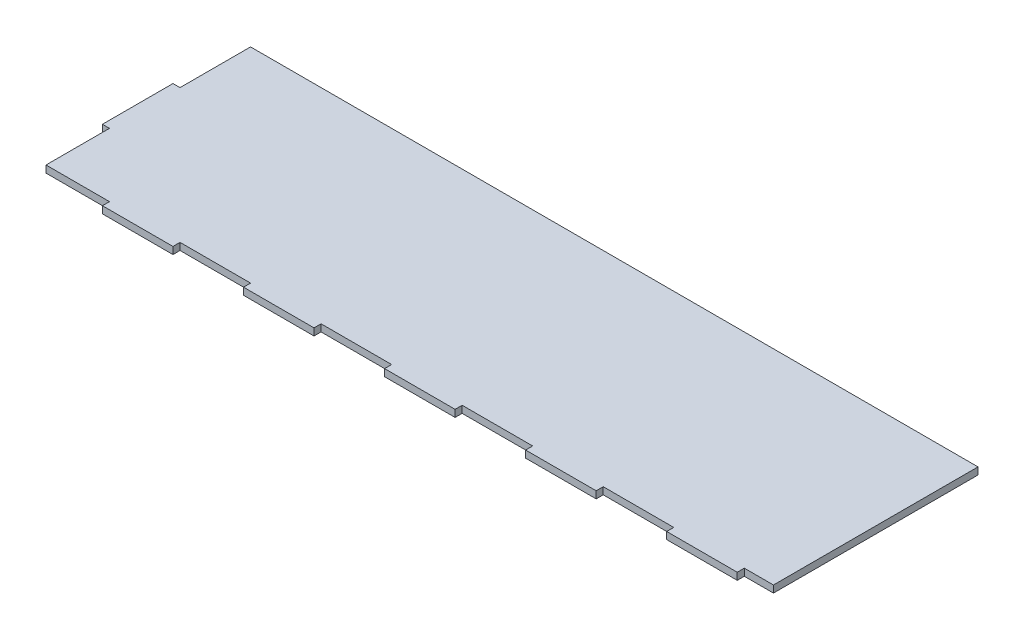
ISO-10303-21;
HEADER;
FILE_DESCRIPTION(('STEP AP214'),'2;1');
FILE_NAME('part.step','',(''),(''),'','','');
FILE_SCHEMA(('AUTOMOTIVE_DESIGN { 1 0 10303 214 1 1 1 1 }'));
ENDSEC;
DATA;
#1=APPLICATION_CONTEXT('core data for automotive mechanical design processes');
#2=APPLICATION_PROTOCOL_DEFINITION('international standard','automotive_design',2000,#1);
#3=PRODUCT_CONTEXT('',#1,'mechanical');
#4=PRODUCT('Part','Part','',(#3));
#5=PRODUCT_RELATED_PRODUCT_CATEGORY('part','',(#4));
#6=PRODUCT_DEFINITION_FORMATION('','',#4);
#7=PRODUCT_DEFINITION_CONTEXT('part definition',#1,'design');
#8=PRODUCT_DEFINITION('design','',#6,#7);
#9=PRODUCT_DEFINITION_SHAPE('','',#8);
#10=(LENGTH_UNIT() NAMED_UNIT(*) SI_UNIT(.MILLI.,.METRE.));
#11=(NAMED_UNIT(*) PLANE_ANGLE_UNIT() SI_UNIT($,.RADIAN.));
#12=(NAMED_UNIT(*) SI_UNIT($,.STERADIAN.) SOLID_ANGLE_UNIT());
#13=UNCERTAINTY_MEASURE_WITH_UNIT(LENGTH_MEASURE(1.E-05),#10,'distance_accuracy_value','');
#14=(GEOMETRIC_REPRESENTATION_CONTEXT(3) GLOBAL_UNCERTAINTY_ASSIGNED_CONTEXT((#13)) GLOBAL_UNIT_ASSIGNED_CONTEXT((#10,
#11,#12)) REPRESENTATION_CONTEXT('',''));
#15=CARTESIAN_POINT('',(0.,0.,0.));
#16=DIRECTION('',(0.,0.,1.));
#17=DIRECTION('',(1.,0.,0.));
#18=AXIS2_PLACEMENT_3D('',#15,#16,#17);
#19=CARTESIAN_POINT('',(-2.60000000000005,0.,0.));
#20=DIRECTION('',(1.,0.,0.));
#21=DIRECTION('',(0.,0.,-1.));
#22=AXIS2_PLACEMENT_3D('',#19,#20,#21);
#23=PLANE('',#22);
#24=DIRECTION('',(0.,0.,1.));
#25=VECTOR('',#24,1.);
#26=CARTESIAN_POINT('',(-2.60000000000005,0.,0.));
#27=LINE('',#26,#25);
#28=CARTESIAN_POINT('',(-2.60000000000005,0.,-45.));
#29=VERTEX_POINT('',#28);
#30=CARTESIAN_POINT('',(-2.60000000000005,0.,42.));
#31=VERTEX_POINT('',#30);
#32=EDGE_CURVE('E241',#29,#31,#27,.T.);
#33=ORIENTED_EDGE('',*,*,#32,.F.);
#34=DIRECTION('',(0.,1.,0.));
#35=VECTOR('',#34,1.);
#36=CARTESIAN_POINT('',(-2.60000000000005,3.,-45.));
#37=LINE('',#36,#35);
#38=CARTESIAN_POINT('',(-2.60000000000005,3.,-45.));
#39=VERTEX_POINT('',#38);
#40=EDGE_CURVE('E65',#29,#39,#37,.T.);
#41=ORIENTED_EDGE('',*,*,#40,.T.);
#42=DIRECTION('',(0.,0.,1.));
#43=VECTOR('',#42,1.);
#44=CARTESIAN_POINT('',(-2.60000000000005,3.,0.));
#45=LINE('',#44,#43);
#46=CARTESIAN_POINT('',(-2.60000000000005,3.,42.));
#47=VERTEX_POINT('',#46);
#48=EDGE_CURVE('E58',#39,#47,#45,.T.);
#49=ORIENTED_EDGE('',*,*,#48,.T.);
#50=DIRECTION('',(0.,-1.,0.));
#51=VECTOR('',#50,1.);
#52=CARTESIAN_POINT('',(-2.60000000000005,0.,42.));
#53=LINE('',#52,#51);
#54=EDGE_CURVE('E12',#47,#31,#53,.T.);
#55=ORIENTED_EDGE('',*,*,#54,.T.);
#56=EDGE_LOOP('',(#33,#41,#49,#55));
#57=FACE_BOUND('',#56,.T.);
#58=ADVANCED_FACE('F42',(#57),#23,.T.);
#59=CARTESIAN_POINT('',(-315.,3.,-45.));
#60=DIRECTION('',(0.,0.,1.));
#61=DIRECTION('',(1.,0.,0.));
#62=AXIS2_PLACEMENT_3D('',#59,#60,#61);
#63=PLANE('',#62);
#64=ORIENTED_EDGE('',*,*,#40,.F.);
#65=DIRECTION('',(-1.,0.,0.));
#66=VECTOR('',#65,1.);
#67=CARTESIAN_POINT('',(-315.,0.,-45.));
#68=LINE('',#67,#66);
#69=CARTESIAN_POINT('',(-312.,0.,-45.));
#70=VERTEX_POINT('',#69);
#71=EDGE_CURVE('E244',#29,#70,#68,.T.);
#72=ORIENTED_EDGE('',*,*,#71,.T.);
#73=DIRECTION('',(0.,1.,0.));
#74=VECTOR('',#73,1.);
#75=CARTESIAN_POINT('',(-312.,0.,-45.));
#76=LINE('',#75,#74);
#77=CARTESIAN_POINT('',(-312.,3.,-45.));
#78=VERTEX_POINT('',#77);
#79=EDGE_CURVE('E286',#70,#78,#76,.T.);
#80=ORIENTED_EDGE('',*,*,#79,.T.);
#81=DIRECTION('',(-1.,0.,0.));
#82=VECTOR('',#81,1.);
#83=CARTESIAN_POINT('',(-315.,3.,-45.));
#84=LINE('',#83,#82);
#85=EDGE_CURVE('E475',#39,#78,#84,.T.);
#86=ORIENTED_EDGE('',*,*,#85,.F.);
#87=EDGE_LOOP('',(#64,#72,#80,#86));
#88=FACE_BOUND('',#87,.T.);
#89=ADVANCED_FACE('F44',(#88),#63,.F.);
#90=CARTESIAN_POINT('',(0.,3.,0.));
#91=DIRECTION('',(0.,-1.,0.));
#92=DIRECTION('',(0.,0.,-1.));
#93=AXIS2_PLACEMENT_3D('',#90,#91,#92);
#94=PLANE('',#93);
#95=ORIENTED_EDGE('',*,*,#48,.F.);
#96=ORIENTED_EDGE('',*,*,#85,.T.);
#97=DIRECTION('',(0.,0.,-1.));
#98=VECTOR('',#97,1.);
#99=CARTESIAN_POINT('',(-312.,3.,-45.));
#100=LINE('',#99,#98);
#101=CARTESIAN_POINT('',(-312.,3.,-15.));
#102=VERTEX_POINT('',#101);
#103=EDGE_CURVE('E276',#102,#78,#100,.T.);
#104=ORIENTED_EDGE('',*,*,#103,.F.);
#105=DIRECTION('',(1.,0.,0.));
#106=VECTOR('',#105,1.);
#107=CARTESIAN_POINT('',(-315.,3.,-15.));
#108=LINE('',#107,#106);
#109=CARTESIAN_POINT('',(-315.,3.,-15.));
#110=VERTEX_POINT('',#109);
#111=EDGE_CURVE('E270',#110,#102,#108,.T.);
#112=ORIENTED_EDGE('',*,*,#111,.F.);
#113=DIRECTION('',(0.,0.,1.));
#114=VECTOR('',#113,1.);
#115=CARTESIAN_POINT('',(-315.,3.,45.));
#116=LINE('',#115,#114);
#117=CARTESIAN_POINT('',(-315.,3.,15.));
#118=VERTEX_POINT('',#117);
#119=EDGE_CURVE('E478',#110,#118,#116,.T.);
#120=ORIENTED_EDGE('',*,*,#119,.T.);
#121=DIRECTION('',(-1.,0.,0.));
#122=VECTOR('',#121,1.);
#123=CARTESIAN_POINT('',(-315.,3.,15.));
#124=LINE('',#123,#122);
#125=CARTESIAN_POINT('',(-312.,3.,15.));
#126=VERTEX_POINT('',#125);
#127=EDGE_CURVE('E257',#126,#118,#124,.T.);
#128=ORIENTED_EDGE('',*,*,#127,.F.);
#129=DIRECTION('',(0.,0.,-1.));
#130=VECTOR('',#129,1.);
#131=CARTESIAN_POINT('',(-312.,3.,42.));
#132=LINE('',#131,#130);
#133=CARTESIAN_POINT('',(-312.,3.,42.));
#134=VERTEX_POINT('',#133);
#135=EDGE_CURVE('E251',#134,#126,#132,.T.);
#136=ORIENTED_EDGE('',*,*,#135,.F.);
#137=DIRECTION('',(-1.,0.,0.));
#138=VECTOR('',#137,1.);
#139=CARTESIAN_POINT('',(-315.,3.,42.));
#140=LINE('',#139,#138);
#141=CARTESIAN_POINT('',(-285.,3.,42.));
#142=VERTEX_POINT('',#141);
#143=EDGE_CURVE('E388',#142,#134,#140,.T.);
#144=ORIENTED_EDGE('',*,*,#143,.F.);
#145=DIRECTION('',(0.,0.,-1.));
#146=VECTOR('',#145,1.);
#147=CARTESIAN_POINT('',(-285.,3.,45.));
#148=LINE('',#147,#146);
#149=CARTESIAN_POINT('',(-285.,3.,45.));
#150=VERTEX_POINT('',#149);
#151=EDGE_CURVE('E290',#150,#142,#148,.T.);
#152=ORIENTED_EDGE('',*,*,#151,.F.);
#153=DIRECTION('',(1.,0.,0.));
#154=VECTOR('',#153,1.);
#155=CARTESIAN_POINT('',(-315.,3.,45.));
#156=LINE('',#155,#154);
#157=CARTESIAN_POINT('',(-255.,3.,45.));
#158=VERTEX_POINT('',#157);
#159=EDGE_CURVE('E504',#150,#158,#156,.T.);
#160=ORIENTED_EDGE('',*,*,#159,.T.);
#161=DIRECTION('',(0.,0.,1.));
#162=VECTOR('',#161,1.);
#163=CARTESIAN_POINT('',(-255.,3.,45.));
#164=LINE('',#163,#162);
#165=CARTESIAN_POINT('',(-255.,3.,42.));
#166=VERTEX_POINT('',#165);
#167=EDGE_CURVE('E429',#166,#158,#164,.T.);
#168=ORIENTED_EDGE('',*,*,#167,.F.);
#169=DIRECTION('',(-1.,0.,0.));
#170=VECTOR('',#169,1.);
#171=CARTESIAN_POINT('',(-255.,3.,42.));
#172=LINE('',#171,#170);
#173=CARTESIAN_POINT('',(-225.,3.,42.));
#174=VERTEX_POINT('',#173);
#175=EDGE_CURVE('E444',#174,#166,#172,.T.);
#176=ORIENTED_EDGE('',*,*,#175,.F.);
#177=DIRECTION('',(0.,0.,-1.));
#178=VECTOR('',#177,1.);
#179=CARTESIAN_POINT('',(-225.,3.,45.));
#180=LINE('',#179,#178);
#181=CARTESIAN_POINT('',(-225.,3.,45.));
#182=VERTEX_POINT('',#181);
#183=EDGE_CURVE('E456',#182,#174,#180,.T.);
#184=ORIENTED_EDGE('',*,*,#183,.F.);
#185=CARTESIAN_POINT('',(-195.,3.,45.));
#186=VERTEX_POINT('',#185);
#187=EDGE_CURVE('E488',#182,#186,#156,.T.);
#188=ORIENTED_EDGE('',*,*,#187,.T.);
#189=DIRECTION('',(0.,0.,1.));
#190=VECTOR('',#189,1.);
#191=CARTESIAN_POINT('',(-195.,3.,45.));
#192=LINE('',#191,#190);
#193=CARTESIAN_POINT('',(-195.,3.,42.));
#194=VERTEX_POINT('',#193);
#195=EDGE_CURVE('E324',#194,#186,#192,.T.);
#196=ORIENTED_EDGE('',*,*,#195,.F.);
#197=DIRECTION('',(-1.,0.,0.));
#198=VECTOR('',#197,1.);
#199=CARTESIAN_POINT('',(-195.,3.,42.));
#200=LINE('',#199,#198);
#201=CARTESIAN_POINT('',(-165.,3.,42.));
#202=VERTEX_POINT('',#201);
#203=EDGE_CURVE('E408',#202,#194,#200,.T.);
#204=ORIENTED_EDGE('',*,*,#203,.F.);
#205=DIRECTION('',(0.,0.,-1.));
#206=VECTOR('',#205,1.);
#207=CARTESIAN_POINT('',(-165.,3.,45.));
#208=LINE('',#207,#206);
#209=CARTESIAN_POINT('',(-165.,3.,45.));
#210=VERTEX_POINT('',#209);
#211=EDGE_CURVE('E419',#210,#202,#208,.T.);
#212=ORIENTED_EDGE('',*,*,#211,.F.);
#213=CARTESIAN_POINT('',(-135.,3.,45.));
#214=VERTEX_POINT('',#213);
#215=EDGE_CURVE('E636',#210,#214,#156,.T.);
#216=ORIENTED_EDGE('',*,*,#215,.T.);
#217=DIRECTION('',(0.,0.,1.));
#218=VECTOR('',#217,1.);
#219=CARTESIAN_POINT('',(-135.,3.,45.));
#220=LINE('',#219,#218);
#221=CARTESIAN_POINT('',(-135.,3.,42.));
#222=VERTEX_POINT('',#221);
#223=EDGE_CURVE('E310',#222,#214,#220,.T.);
#224=ORIENTED_EDGE('',*,*,#223,.F.);
#225=DIRECTION('',(-1.,0.,0.));
#226=VECTOR('',#225,1.);
#227=CARTESIAN_POINT('',(-135.,3.,42.));
#228=LINE('',#227,#226);
#229=CARTESIAN_POINT('',(-105.,3.,42.));
#230=VERTEX_POINT('',#229);
#231=EDGE_CURVE('E301',#230,#222,#228,.T.);
#232=ORIENTED_EDGE('',*,*,#231,.F.);
#233=DIRECTION('',(0.,0.,-1.));
#234=VECTOR('',#233,1.);
#235=CARTESIAN_POINT('',(-105.,3.,45.));
#236=LINE('',#235,#234);
#237=CARTESIAN_POINT('',(-105.,3.,45.));
#238=VERTEX_POINT('',#237);
#239=EDGE_CURVE('E313',#238,#230,#236,.T.);
#240=ORIENTED_EDGE('',*,*,#239,.F.);
#241=CARTESIAN_POINT('',(-75.,3.,45.));
#242=VERTEX_POINT('',#241);
#243=EDGE_CURVE('E487',#238,#242,#156,.T.);
#244=ORIENTED_EDGE('',*,*,#243,.T.);
#245=DIRECTION('',(0.,0.,1.));
#246=VECTOR('',#245,1.);
#247=CARTESIAN_POINT('',(-75.,3.,45.));
#248=LINE('',#247,#246);
#249=CARTESIAN_POINT('',(-75.,3.,42.));
#250=VERTEX_POINT('',#249);
#251=EDGE_CURVE('E348',#250,#242,#248,.T.);
#252=ORIENTED_EDGE('',*,*,#251,.F.);
#253=DIRECTION('',(-1.,0.,0.));
#254=VECTOR('',#253,1.);
#255=CARTESIAN_POINT('',(-75.,3.,42.));
#256=LINE('',#255,#254);
#257=CARTESIAN_POINT('',(-45.,3.,42.));
#258=VERTEX_POINT('',#257);
#259=EDGE_CURVE('E339',#258,#250,#256,.T.);
#260=ORIENTED_EDGE('',*,*,#259,.F.);
#261=DIRECTION('',(0.,0.,-1.));
#262=VECTOR('',#261,1.);
#263=CARTESIAN_POINT('',(-45.,3.,45.));
#264=LINE('',#263,#262);
#265=CARTESIAN_POINT('',(-45.,3.,45.));
#266=VERTEX_POINT('',#265);
#267=EDGE_CURVE('E351',#266,#258,#264,.T.);
#268=ORIENTED_EDGE('',*,*,#267,.F.);
#269=CARTESIAN_POINT('',(-15.,3.,45.));
#270=VERTEX_POINT('',#269);
#271=EDGE_CURVE('E483',#266,#270,#156,.T.);
#272=ORIENTED_EDGE('',*,*,#271,.T.);
#273=DIRECTION('',(0.,0.,1.));
#274=VECTOR('',#273,1.);
#275=CARTESIAN_POINT('',(-15.,3.,45.));
#276=LINE('',#275,#274);
#277=CARTESIAN_POINT('',(-15.,3.,42.));
#278=VERTEX_POINT('',#277);
#279=EDGE_CURVE('E372',#278,#270,#276,.T.);
#280=ORIENTED_EDGE('',*,*,#279,.F.);
#281=DIRECTION('',(-1.,0.,0.));
#282=VECTOR('',#281,1.);
#283=CARTESIAN_POINT('',(-15.,3.,42.));
#284=LINE('',#283,#282);
#285=EDGE_CURVE('E370',#47,#278,#284,.T.);
#286=ORIENTED_EDGE('',*,*,#285,.F.);
#287=EDGE_LOOP('',(#95,#96,#104,#112,#120,#128,#136,#144,#152,#160,#168,#176,#184,#188,#196,
#204,#212,#216,#224,#232,#240,#244,#252,#260,#268,#272,#280,#286));
#288=FACE_BOUND('',#287,.T.);
#289=ADVANCED_FACE('F526',(#288),#94,.F.);
#290=CARTESIAN_POINT('',(0.,0.,0.));
#291=DIRECTION('',(0.,-1.,0.));
#292=DIRECTION('',(0.,0.,-1.));
#293=AXIS2_PLACEMENT_3D('',#290,#291,#292);
#294=PLANE('',#293);
#295=ORIENTED_EDGE('',*,*,#71,.F.);
#296=ORIENTED_EDGE('',*,*,#32,.T.);
#297=DIRECTION('',(-1.,0.,0.));
#298=VECTOR('',#297,1.);
#299=CARTESIAN_POINT('',(-15.,0.,42.));
#300=LINE('',#299,#298);
#301=CARTESIAN_POINT('',(-15.,0.,42.));
#302=VERTEX_POINT('',#301);
#303=EDGE_CURVE('E228',#31,#302,#300,.T.);
#304=ORIENTED_EDGE('',*,*,#303,.T.);
#305=DIRECTION('',(0.,0.,1.));
#306=VECTOR('',#305,1.);
#307=CARTESIAN_POINT('',(-15.,0.,45.));
#308=LINE('',#307,#306);
#309=CARTESIAN_POINT('',(-15.,0.,45.));
#310=VERTEX_POINT('',#309);
#311=EDGE_CURVE('E238',#302,#310,#308,.T.);
#312=ORIENTED_EDGE('',*,*,#311,.T.);
#313=DIRECTION('',(1.,0.,0.));
#314=VECTOR('',#313,1.);
#315=CARTESIAN_POINT('',(-315.,0.,45.));
#316=LINE('',#315,#314);
#317=CARTESIAN_POINT('',(-45.,0.,45.));
#318=VERTEX_POINT('',#317);
#319=EDGE_CURVE('E495',#318,#310,#316,.T.);
#320=ORIENTED_EDGE('',*,*,#319,.F.);
#321=DIRECTION('',(0.,0.,-1.));
#322=VECTOR('',#321,1.);
#323=CARTESIAN_POINT('',(-45.,0.,45.));
#324=LINE('',#323,#322);
#325=CARTESIAN_POINT('',(-45.,0.,42.));
#326=VERTEX_POINT('',#325);
#327=EDGE_CURVE('E338',#318,#326,#324,.T.);
#328=ORIENTED_EDGE('',*,*,#327,.T.);
#329=DIRECTION('',(-1.,0.,0.));
#330=VECTOR('',#329,1.);
#331=CARTESIAN_POINT('',(-75.,0.,42.));
#332=LINE('',#331,#330);
#333=CARTESIAN_POINT('',(-75.,0.,42.));
#334=VERTEX_POINT('',#333);
#335=EDGE_CURVE('E343',#326,#334,#332,.T.);
#336=ORIENTED_EDGE('',*,*,#335,.T.);
#337=DIRECTION('',(0.,0.,1.));
#338=VECTOR('',#337,1.);
#339=CARTESIAN_POINT('',(-75.,0.,45.));
#340=LINE('',#339,#338);
#341=CARTESIAN_POINT('',(-75.,0.,45.));
#342=VERTEX_POINT('',#341);
#343=EDGE_CURVE('E334',#334,#342,#340,.T.);
#344=ORIENTED_EDGE('',*,*,#343,.T.);
#345=CARTESIAN_POINT('',(-105.,0.,45.));
#346=VERTEX_POINT('',#345);
#347=EDGE_CURVE('E499',#346,#342,#316,.T.);
#348=ORIENTED_EDGE('',*,*,#347,.F.);
#349=DIRECTION('',(0.,0.,-1.));
#350=VECTOR('',#349,1.);
#351=CARTESIAN_POINT('',(-105.,0.,45.));
#352=LINE('',#351,#350);
#353=CARTESIAN_POINT('',(-105.,0.,42.));
#354=VERTEX_POINT('',#353);
#355=EDGE_CURVE('E300',#346,#354,#352,.T.);
#356=ORIENTED_EDGE('',*,*,#355,.T.);
#357=DIRECTION('',(-1.,0.,0.));
#358=VECTOR('',#357,1.);
#359=CARTESIAN_POINT('',(-135.,0.,42.));
#360=LINE('',#359,#358);
#361=CARTESIAN_POINT('',(-135.,0.,42.));
#362=VERTEX_POINT('',#361);
#363=EDGE_CURVE('E305',#354,#362,#360,.T.);
#364=ORIENTED_EDGE('',*,*,#363,.T.);
#365=DIRECTION('',(0.,0.,1.));
#366=VECTOR('',#365,1.);
#367=CARTESIAN_POINT('',(-135.,0.,45.));
#368=LINE('',#367,#366);
#369=CARTESIAN_POINT('',(-135.,0.,45.));
#370=VERTEX_POINT('',#369);
#371=EDGE_CURVE('E296',#362,#370,#368,.T.);
#372=ORIENTED_EDGE('',*,*,#371,.T.);
#373=CARTESIAN_POINT('',(-165.,0.,45.));
#374=VERTEX_POINT('',#373);
#375=EDGE_CURVE('E663',#374,#370,#316,.T.);
#376=ORIENTED_EDGE('',*,*,#375,.F.);
#377=DIRECTION('',(0.,0.,-1.));
#378=VECTOR('',#377,1.);
#379=CARTESIAN_POINT('',(-165.,0.,45.));
#380=LINE('',#379,#378);
#381=CARTESIAN_POINT('',(-165.,0.,42.));
#382=VERTEX_POINT('',#381);
#383=EDGE_CURVE('E407',#374,#382,#380,.T.);
#384=ORIENTED_EDGE('',*,*,#383,.T.);
#385=DIRECTION('',(-1.,0.,0.));
#386=VECTOR('',#385,1.);
#387=CARTESIAN_POINT('',(-195.,0.,42.));
#388=LINE('',#387,#386);
#389=CARTESIAN_POINT('',(-195.,0.,42.));
#390=VERTEX_POINT('',#389);
#391=EDGE_CURVE('E412',#382,#390,#388,.T.);
#392=ORIENTED_EDGE('',*,*,#391,.T.);
#393=DIRECTION('',(0.,0.,1.));
#394=VECTOR('',#393,1.);
#395=CARTESIAN_POINT('',(-195.,0.,45.));
#396=LINE('',#395,#394);
#397=CARTESIAN_POINT('',(-195.,0.,45.));
#398=VERTEX_POINT('',#397);
#399=EDGE_CURVE('E403',#390,#398,#396,.T.);
#400=ORIENTED_EDGE('',*,*,#399,.T.);
#401=CARTESIAN_POINT('',(-225.,0.,45.));
#402=VERTEX_POINT('',#401);
#403=EDGE_CURVE('E500',#402,#398,#316,.T.);
#404=ORIENTED_EDGE('',*,*,#403,.F.);
#405=DIRECTION('',(0.,0.,-1.));
#406=VECTOR('',#405,1.);
#407=CARTESIAN_POINT('',(-225.,0.,45.));
#408=LINE('',#407,#406);
#409=CARTESIAN_POINT('',(-225.,0.,42.));
#410=VERTEX_POINT('',#409);
#411=EDGE_CURVE('E443',#402,#410,#408,.T.);
#412=ORIENTED_EDGE('',*,*,#411,.T.);
#413=DIRECTION('',(-1.,0.,0.));
#414=VECTOR('',#413,1.);
#415=CARTESIAN_POINT('',(-255.,0.,42.));
#416=LINE('',#415,#414);
#417=CARTESIAN_POINT('',(-255.,0.,42.));
#418=VERTEX_POINT('',#417);
#419=EDGE_CURVE('E448',#410,#418,#416,.T.);
#420=ORIENTED_EDGE('',*,*,#419,.T.);
#421=DIRECTION('',(0.,0.,1.));
#422=VECTOR('',#421,1.);
#423=CARTESIAN_POINT('',(-255.,0.,45.));
#424=LINE('',#423,#422);
#425=CARTESIAN_POINT('',(-255.,0.,45.));
#426=VERTEX_POINT('',#425);
#427=EDGE_CURVE('E439',#418,#426,#424,.T.);
#428=ORIENTED_EDGE('',*,*,#427,.T.);
#429=CARTESIAN_POINT('',(-285.,0.,45.));
#430=VERTEX_POINT('',#429);
#431=EDGE_CURVE('E479',#430,#426,#316,.T.);
#432=ORIENTED_EDGE('',*,*,#431,.F.);
#433=DIRECTION('',(0.,0.,-1.));
#434=VECTOR('',#433,1.);
#435=CARTESIAN_POINT('',(-285.,0.,45.));
#436=LINE('',#435,#434);
#437=CARTESIAN_POINT('',(-285.,0.,42.));
#438=VERTEX_POINT('',#437);
#439=EDGE_CURVE('E383',#430,#438,#436,.T.);
#440=ORIENTED_EDGE('',*,*,#439,.T.);
#441=DIRECTION('',(-1.,0.,0.));
#442=VECTOR('',#441,1.);
#443=CARTESIAN_POINT('',(-315.,0.,42.));
#444=LINE('',#443,#442);
#445=CARTESIAN_POINT('',(-312.,0.,42.));
#446=VERTEX_POINT('',#445);
#447=EDGE_CURVE('E387',#438,#446,#444,.T.);
#448=ORIENTED_EDGE('',*,*,#447,.T.);
#449=DIRECTION('',(0.,0.,1.));
#450=VECTOR('',#449,1.);
#451=CARTESIAN_POINT('',(-312.,0.,0.));
#452=LINE('',#451,#450);
#453=CARTESIAN_POINT('',(-312.,0.,15.));
#454=VERTEX_POINT('',#453);
#455=EDGE_CURVE('E265',#454,#446,#452,.T.);
#456=ORIENTED_EDGE('',*,*,#455,.F.);
#457=DIRECTION('',(1.,0.,0.));
#458=VECTOR('',#457,1.);
#459=CARTESIAN_POINT('',(0.,0.,15.));
#460=LINE('',#459,#458);
#461=CARTESIAN_POINT('',(-315.,0.,15.));
#462=VERTEX_POINT('',#461);
#463=EDGE_CURVE('E51',#462,#454,#460,.T.);
#464=ORIENTED_EDGE('',*,*,#463,.F.);
#465=DIRECTION('',(0.,0.,1.));
#466=VECTOR('',#465,1.);
#467=CARTESIAN_POINT('',(-315.,0.,45.));
#468=LINE('',#467,#466);
#469=CARTESIAN_POINT('',(-315.,0.,-15.));
#470=VERTEX_POINT('',#469);
#471=EDGE_CURVE('E491',#470,#462,#468,.T.);
#472=ORIENTED_EDGE('',*,*,#471,.F.);
#473=DIRECTION('',(1.,0.,0.));
#474=VECTOR('',#473,1.);
#475=CARTESIAN_POINT('',(-315.,0.,-15.));
#476=LINE('',#475,#474);
#477=CARTESIAN_POINT('',(-312.,0.,-15.));
#478=VERTEX_POINT('',#477);
#479=EDGE_CURVE('E271',#470,#478,#476,.T.);
#480=ORIENTED_EDGE('',*,*,#479,.T.);
#481=DIRECTION('',(0.,0.,-1.));
#482=VECTOR('',#481,1.);
#483=CARTESIAN_POINT('',(-312.,0.,-45.));
#484=LINE('',#483,#482);
#485=EDGE_CURVE('E275',#478,#70,#484,.T.);
#486=ORIENTED_EDGE('',*,*,#485,.T.);
#487=EDGE_LOOP('',(#295,#296,#304,#312,#320,#328,#336,#344,#348,#356,#364,#372,#376,#384,#392,
#400,#404,#412,#420,#428,#432,#440,#448,#456,#464,#472,#480,#486));
#488=FACE_BOUND('',#487,.T.);
#489=ADVANCED_FACE('F242',(#488),#294,.T.);
#490=CARTESIAN_POINT('',(-15.,0.,42.));
#491=DIRECTION('',(0.,0.,-1.));
#492=DIRECTION('',(-1.,0.,0.));
#493=AXIS2_PLACEMENT_3D('',#490,#491,#492);
#494=PLANE('',#493);
#495=ORIENTED_EDGE('',*,*,#54,.F.);
#496=ORIENTED_EDGE('',*,*,#285,.T.);
#497=DIRECTION('',(0.,1.,0.));
#498=VECTOR('',#497,1.);
#499=CARTESIAN_POINT('',(-15.,0.,42.));
#500=LINE('',#499,#498);
#501=EDGE_CURVE('E232',#302,#278,#500,.T.);
#502=ORIENTED_EDGE('',*,*,#501,.F.);
#503=ORIENTED_EDGE('',*,*,#303,.F.);
#504=EDGE_LOOP('',(#495,#496,#502,#503));
#505=FACE_BOUND('',#504,.T.);
#506=ADVANCED_FACE('F230',(#505),#494,.F.);
#507=CARTESIAN_POINT('',(-315.,3.,45.));
#508=DIRECTION('',(0.,0.,-1.));
#509=DIRECTION('',(-1.,0.,0.));
#510=AXIS2_PLACEMENT_3D('',#507,#508,#509);
#511=PLANE('',#510);
#512=ORIENTED_EDGE('',*,*,#319,.T.);
#513=DIRECTION('',(0.,1.,0.));
#514=VECTOR('',#513,1.);
#515=CARTESIAN_POINT('',(-15.,0.,45.));
#516=LINE('',#515,#514);
#517=EDGE_CURVE('E237',#310,#270,#516,.T.);
#518=ORIENTED_EDGE('',*,*,#517,.T.);
#519=ORIENTED_EDGE('',*,*,#271,.F.);
#520=DIRECTION('',(0.,1.,0.));
#521=VECTOR('',#520,1.);
#522=CARTESIAN_POINT('',(-45.,0.,45.));
#523=LINE('',#522,#521);
#524=EDGE_CURVE('E363',#318,#266,#523,.T.);
#525=ORIENTED_EDGE('',*,*,#524,.F.);
#526=EDGE_LOOP('',(#512,#518,#519,#525));
#527=FACE_BOUND('',#526,.T.);
#528=ADVANCED_FACE('F585',(#527),#511,.F.);
#529=ORIENTED_EDGE('',*,*,#347,.T.);
#530=DIRECTION('',(0.,1.,0.));
#531=VECTOR('',#530,1.);
#532=CARTESIAN_POINT('',(-75.,0.,45.));
#533=LINE('',#532,#531);
#534=EDGE_CURVE('E347',#342,#242,#533,.T.);
#535=ORIENTED_EDGE('',*,*,#534,.T.);
#536=ORIENTED_EDGE('',*,*,#243,.F.);
#537=DIRECTION('',(0.,1.,0.));
#538=VECTOR('',#537,1.);
#539=CARTESIAN_POINT('',(-105.,0.,45.));
#540=LINE('',#539,#538);
#541=EDGE_CURVE('E328',#346,#238,#540,.T.);
#542=ORIENTED_EDGE('',*,*,#541,.F.);
#543=EDGE_LOOP('',(#529,#535,#536,#542));
#544=FACE_BOUND('',#543,.T.);
#545=ADVANCED_FACE('F619',(#544),#511,.F.);
#546=ORIENTED_EDGE('',*,*,#375,.T.);
#547=DIRECTION('',(0.,1.,0.));
#548=VECTOR('',#547,1.);
#549=CARTESIAN_POINT('',(-135.,0.,45.));
#550=LINE('',#549,#548);
#551=EDGE_CURVE('E309',#370,#214,#550,.T.);
#552=ORIENTED_EDGE('',*,*,#551,.T.);
#553=ORIENTED_EDGE('',*,*,#215,.F.);
#554=DIRECTION('',(0.,1.,0.));
#555=VECTOR('',#554,1.);
#556=CARTESIAN_POINT('',(-165.,0.,45.));
#557=LINE('',#556,#555);
#558=EDGE_CURVE('E433',#374,#210,#557,.T.);
#559=ORIENTED_EDGE('',*,*,#558,.F.);
#560=EDGE_LOOP('',(#546,#552,#553,#559));
#561=FACE_BOUND('',#560,.T.);
#562=ADVANCED_FACE('F631',(#561),#511,.F.);
#563=ORIENTED_EDGE('',*,*,#403,.T.);
#564=DIRECTION('',(0.,1.,0.));
#565=VECTOR('',#564,1.);
#566=CARTESIAN_POINT('',(-195.,0.,45.));
#567=LINE('',#566,#565);
#568=EDGE_CURVE('E416',#398,#186,#567,.T.);
#569=ORIENTED_EDGE('',*,*,#568,.T.);
#570=ORIENTED_EDGE('',*,*,#187,.F.);
#571=DIRECTION('',(0.,1.,0.));
#572=VECTOR('',#571,1.);
#573=CARTESIAN_POINT('',(-225.,0.,45.));
#574=LINE('',#573,#572);
#575=EDGE_CURVE('E469',#402,#182,#574,.T.);
#576=ORIENTED_EDGE('',*,*,#575,.F.);
#577=EDGE_LOOP('',(#563,#569,#570,#576));
#578=FACE_BOUND('',#577,.T.);
#579=ADVANCED_FACE('F626',(#578),#511,.F.);
#580=ORIENTED_EDGE('',*,*,#159,.F.);
#581=DIRECTION('',(0.,1.,0.));
#582=VECTOR('',#581,1.);
#583=CARTESIAN_POINT('',(-285.,0.,45.));
#584=LINE('',#583,#582);
#585=EDGE_CURVE('E392',#430,#150,#584,.T.);
#586=ORIENTED_EDGE('',*,*,#585,.F.);
#587=ORIENTED_EDGE('',*,*,#431,.T.);
#588=DIRECTION('',(0.,1.,0.));
#589=VECTOR('',#588,1.);
#590=CARTESIAN_POINT('',(-255.,0.,45.));
#591=LINE('',#590,#589);
#592=EDGE_CURVE('E452',#426,#158,#591,.T.);
#593=ORIENTED_EDGE('',*,*,#592,.T.);
#594=EDGE_LOOP('',(#580,#586,#587,#593));
#595=FACE_BOUND('',#594,.T.);
#596=ADVANCED_FACE('F621',(#595),#511,.F.);
#597=CARTESIAN_POINT('',(-315.,3.,45.));
#598=DIRECTION('',(1.,0.,0.));
#599=DIRECTION('',(0.,0.,-1.));
#600=AXIS2_PLACEMENT_3D('',#597,#598,#599);
#601=PLANE('',#600);
#602=ORIENTED_EDGE('',*,*,#471,.T.);
#603=DIRECTION('',(0.,1.,0.));
#604=VECTOR('',#603,1.);
#605=CARTESIAN_POINT('',(-315.,-7.,15.));
#606=LINE('',#605,#604);
#607=EDGE_CURVE('E261',#462,#118,#606,.T.);
#608=ORIENTED_EDGE('',*,*,#607,.T.);
#609=ORIENTED_EDGE('',*,*,#119,.F.);
#610=DIRECTION('',(0.,1.,0.));
#611=VECTOR('',#610,1.);
#612=CARTESIAN_POINT('',(-315.,0.,-15.));
#613=LINE('',#612,#611);
#614=EDGE_CURVE('E279',#470,#110,#613,.T.);
#615=ORIENTED_EDGE('',*,*,#614,.F.);
#616=EDGE_LOOP('',(#602,#608,#609,#615));
#617=FACE_BOUND('',#616,.T.);
#618=ADVANCED_FACE('F530',(#617),#601,.F.);
#619=CARTESIAN_POINT('',(-255.,0.,45.));
#620=DIRECTION('',(-1.,0.,0.));
#621=DIRECTION('',(0.,0.,1.));
#622=AXIS2_PLACEMENT_3D('',#619,#620,#621);
#623=PLANE('',#622);
#624=ORIENTED_EDGE('',*,*,#167,.T.);
#625=ORIENTED_EDGE('',*,*,#592,.F.);
#626=ORIENTED_EDGE('',*,*,#427,.F.);
#627=DIRECTION('',(0.,1.,0.));
#628=VECTOR('',#627,1.);
#629=CARTESIAN_POINT('',(-255.,0.,42.));
#630=LINE('',#629,#628);
#631=EDGE_CURVE('E463',#418,#166,#630,.T.);
#632=ORIENTED_EDGE('',*,*,#631,.T.);
#633=EDGE_LOOP('',(#624,#625,#626,#632));
#634=FACE_BOUND('',#633,.T.);
#635=ADVANCED_FACE('F608',(#634),#623,.F.);
#636=CARTESIAN_POINT('',(-255.,0.,42.));
#637=DIRECTION('',(0.,0.,-1.));
#638=DIRECTION('',(-1.,0.,0.));
#639=AXIS2_PLACEMENT_3D('',#636,#637,#638);
#640=PLANE('',#639);
#641=ORIENTED_EDGE('',*,*,#175,.T.);
#642=ORIENTED_EDGE('',*,*,#631,.F.);
#643=ORIENTED_EDGE('',*,*,#419,.F.);
#644=DIRECTION('',(0.,1.,0.));
#645=VECTOR('',#644,1.);
#646=CARTESIAN_POINT('',(-225.,0.,42.));
#647=LINE('',#646,#645);
#648=EDGE_CURVE('E466',#410,#174,#647,.T.);
#649=ORIENTED_EDGE('',*,*,#648,.T.);
#650=EDGE_LOOP('',(#641,#642,#643,#649));
#651=FACE_BOUND('',#650,.T.);
#652=ADVANCED_FACE('F605',(#651),#640,.F.);
#653=CARTESIAN_POINT('',(-225.,0.,45.));
#654=DIRECTION('',(1.,0.,0.));
#655=DIRECTION('',(0.,0.,-1.));
#656=AXIS2_PLACEMENT_3D('',#653,#654,#655);
#657=PLANE('',#656);
#658=ORIENTED_EDGE('',*,*,#183,.T.);
#659=ORIENTED_EDGE('',*,*,#648,.F.);
#660=ORIENTED_EDGE('',*,*,#411,.F.);
#661=ORIENTED_EDGE('',*,*,#575,.T.);
#662=EDGE_LOOP('',(#658,#659,#660,#661));
#663=FACE_BOUND('',#662,.T.);
#664=ADVANCED_FACE('F603',(#663),#657,.F.);
#665=CARTESIAN_POINT('',(-195.,0.,45.));
#666=DIRECTION('',(-1.,0.,0.));
#667=DIRECTION('',(0.,0.,1.));
#668=AXIS2_PLACEMENT_3D('',#665,#666,#667);
#669=PLANE('',#668);
#670=ORIENTED_EDGE('',*,*,#195,.T.);
#671=ORIENTED_EDGE('',*,*,#568,.F.);
#672=ORIENTED_EDGE('',*,*,#399,.F.);
#673=DIRECTION('',(0.,1.,0.));
#674=VECTOR('',#673,1.);
#675=CARTESIAN_POINT('',(-195.,0.,42.));
#676=LINE('',#675,#674);
#677=EDGE_CURVE('E426',#390,#194,#676,.T.);
#678=ORIENTED_EDGE('',*,*,#677,.T.);
#679=EDGE_LOOP('',(#670,#671,#672,#678));
#680=FACE_BOUND('',#679,.T.);
#681=ADVANCED_FACE('F596',(#680),#669,.F.);
#682=CARTESIAN_POINT('',(-195.,0.,42.));
#683=DIRECTION('',(0.,0.,-1.));
#684=DIRECTION('',(-1.,0.,0.));
#685=AXIS2_PLACEMENT_3D('',#682,#683,#684);
#686=PLANE('',#685);
#687=ORIENTED_EDGE('',*,*,#203,.T.);
#688=ORIENTED_EDGE('',*,*,#677,.F.);
#689=ORIENTED_EDGE('',*,*,#391,.F.);
#690=DIRECTION('',(0.,1.,0.));
#691=VECTOR('',#690,1.);
#692=CARTESIAN_POINT('',(-165.,0.,42.));
#693=LINE('',#692,#691);
#694=EDGE_CURVE('E430',#382,#202,#693,.T.);
#695=ORIENTED_EDGE('',*,*,#694,.T.);
#696=EDGE_LOOP('',(#687,#688,#689,#695));
#697=FACE_BOUND('',#696,.T.);
#698=ADVANCED_FACE('F593',(#697),#686,.F.);
#699=CARTESIAN_POINT('',(-165.,0.,45.));
#700=DIRECTION('',(1.,0.,0.));
#701=DIRECTION('',(0.,0.,-1.));
#702=AXIS2_PLACEMENT_3D('',#699,#700,#701);
#703=PLANE('',#702);
#704=ORIENTED_EDGE('',*,*,#211,.T.);
#705=ORIENTED_EDGE('',*,*,#694,.F.);
#706=ORIENTED_EDGE('',*,*,#383,.F.);
#707=ORIENTED_EDGE('',*,*,#558,.T.);
#708=EDGE_LOOP('',(#704,#705,#706,#707));
#709=FACE_BOUND('',#708,.T.);
#710=ADVANCED_FACE('F569',(#709),#703,.F.);
#711=CARTESIAN_POINT('',(-135.,0.,45.));
#712=DIRECTION('',(-1.,0.,0.));
#713=DIRECTION('',(0.,0.,1.));
#714=AXIS2_PLACEMENT_3D('',#711,#712,#713);
#715=PLANE('',#714);
#716=ORIENTED_EDGE('',*,*,#223,.T.);
#717=ORIENTED_EDGE('',*,*,#551,.F.);
#718=ORIENTED_EDGE('',*,*,#371,.F.);
#719=DIRECTION('',(0.,1.,0.));
#720=VECTOR('',#719,1.);
#721=CARTESIAN_POINT('',(-135.,0.,42.));
#722=LINE('',#721,#720);
#723=EDGE_CURVE('E321',#362,#222,#722,.T.);
#724=ORIENTED_EDGE('',*,*,#723,.T.);
#725=EDGE_LOOP('',(#716,#717,#718,#724));
#726=FACE_BOUND('',#725,.T.);
#727=ADVANCED_FACE('F561',(#726),#715,.F.);
#728=CARTESIAN_POINT('',(-135.,0.,42.));
#729=DIRECTION('',(0.,0.,-1.));
#730=DIRECTION('',(-1.,0.,0.));
#731=AXIS2_PLACEMENT_3D('',#728,#729,#730);
#732=PLANE('',#731);
#733=ORIENTED_EDGE('',*,*,#231,.T.);
#734=ORIENTED_EDGE('',*,*,#723,.F.);
#735=ORIENTED_EDGE('',*,*,#363,.F.);
#736=DIRECTION('',(0.,1.,0.));
#737=VECTOR('',#736,1.);
#738=CARTESIAN_POINT('',(-105.,0.,42.));
#739=LINE('',#738,#737);
#740=EDGE_CURVE('E325',#354,#230,#739,.T.);
#741=ORIENTED_EDGE('',*,*,#740,.T.);
#742=EDGE_LOOP('',(#733,#734,#735,#741));
#743=FACE_BOUND('',#742,.T.);
#744=ADVANCED_FACE('F557',(#743),#732,.F.);
#745=CARTESIAN_POINT('',(-105.,0.,45.));
#746=DIRECTION('',(1.,0.,0.));
#747=DIRECTION('',(0.,0.,-1.));
#748=AXIS2_PLACEMENT_3D('',#745,#746,#747);
#749=PLANE('',#748);
#750=ORIENTED_EDGE('',*,*,#239,.T.);
#751=ORIENTED_EDGE('',*,*,#740,.F.);
#752=ORIENTED_EDGE('',*,*,#355,.F.);
#753=ORIENTED_EDGE('',*,*,#541,.T.);
#754=EDGE_LOOP('',(#750,#751,#752,#753));
#755=FACE_BOUND('',#754,.T.);
#756=ADVANCED_FACE('F560',(#755),#749,.F.);
#757=CARTESIAN_POINT('',(-75.,0.,45.));
#758=DIRECTION('',(-1.,0.,0.));
#759=DIRECTION('',(0.,0.,1.));
#760=AXIS2_PLACEMENT_3D('',#757,#758,#759);
#761=PLANE('',#760);
#762=ORIENTED_EDGE('',*,*,#251,.T.);
#763=ORIENTED_EDGE('',*,*,#534,.F.);
#764=ORIENTED_EDGE('',*,*,#343,.F.);
#765=DIRECTION('',(0.,1.,0.));
#766=VECTOR('',#765,1.);
#767=CARTESIAN_POINT('',(-75.,0.,42.));
#768=LINE('',#767,#766);
#769=EDGE_CURVE('E314',#334,#250,#768,.T.);
#770=ORIENTED_EDGE('',*,*,#769,.T.);
#771=EDGE_LOOP('',(#762,#763,#764,#770));
#772=FACE_BOUND('',#771,.T.);
#773=ADVANCED_FACE('F565',(#772),#761,.F.);
#774=CARTESIAN_POINT('',(-75.,0.,42.));
#775=DIRECTION('',(0.,0.,-1.));
#776=DIRECTION('',(-1.,0.,0.));
#777=AXIS2_PLACEMENT_3D('',#774,#775,#776);
#778=PLANE('',#777);
#779=ORIENTED_EDGE('',*,*,#259,.T.);
#780=ORIENTED_EDGE('',*,*,#769,.F.);
#781=ORIENTED_EDGE('',*,*,#335,.F.);
#782=DIRECTION('',(0.,1.,0.));
#783=VECTOR('',#782,1.);
#784=CARTESIAN_POINT('',(-45.,0.,42.));
#785=LINE('',#784,#783);
#786=EDGE_CURVE('E360',#326,#258,#785,.T.);
#787=ORIENTED_EDGE('',*,*,#786,.T.);
#788=EDGE_LOOP('',(#779,#780,#781,#787));
#789=FACE_BOUND('',#788,.T.);
#790=ADVANCED_FACE('F571',(#789),#778,.F.);
#791=CARTESIAN_POINT('',(-45.,0.,45.));
#792=DIRECTION('',(1.,0.,0.));
#793=DIRECTION('',(0.,0.,-1.));
#794=AXIS2_PLACEMENT_3D('',#791,#792,#793);
#795=PLANE('',#794);
#796=ORIENTED_EDGE('',*,*,#267,.T.);
#797=ORIENTED_EDGE('',*,*,#786,.F.);
#798=ORIENTED_EDGE('',*,*,#327,.F.);
#799=ORIENTED_EDGE('',*,*,#524,.T.);
#800=EDGE_LOOP('',(#796,#797,#798,#799));
#801=FACE_BOUND('',#800,.T.);
#802=ADVANCED_FACE('F574',(#801),#795,.F.);
#803=CARTESIAN_POINT('',(-15.,0.,45.));
#804=DIRECTION('',(-1.,0.,0.));
#805=DIRECTION('',(0.,0.,1.));
#806=AXIS2_PLACEMENT_3D('',#803,#804,#805);
#807=PLANE('',#806);
#808=ORIENTED_EDGE('',*,*,#279,.T.);
#809=ORIENTED_EDGE('',*,*,#517,.F.);
#810=ORIENTED_EDGE('',*,*,#311,.F.);
#811=ORIENTED_EDGE('',*,*,#501,.T.);
#812=EDGE_LOOP('',(#808,#809,#810,#811));
#813=FACE_BOUND('',#812,.T.);
#814=ADVANCED_FACE('F578',(#813),#807,.F.);
#815=CARTESIAN_POINT('',(-315.,0.,42.));
#816=DIRECTION('',(0.,0.,-1.));
#817=DIRECTION('',(-1.,0.,0.));
#818=AXIS2_PLACEMENT_3D('',#815,#816,#817);
#819=PLANE('',#818);
#820=ORIENTED_EDGE('',*,*,#143,.T.);
#821=DIRECTION('',(0.,-1.,0.));
#822=VECTOR('',#821,1.);
#823=CARTESIAN_POINT('',(-312.,0.,42.));
#824=LINE('',#823,#822);
#825=EDGE_CURVE('E501',#134,#446,#824,.T.);
#826=ORIENTED_EDGE('',*,*,#825,.T.);
#827=ORIENTED_EDGE('',*,*,#447,.F.);
#828=DIRECTION('',(0.,1.,0.));
#829=VECTOR('',#828,1.);
#830=CARTESIAN_POINT('',(-285.,0.,42.));
#831=LINE('',#830,#829);
#832=EDGE_CURVE('E375',#438,#142,#831,.T.);
#833=ORIENTED_EDGE('',*,*,#832,.T.);
#834=EDGE_LOOP('',(#820,#826,#827,#833));
#835=FACE_BOUND('',#834,.T.);
#836=ADVANCED_FACE('F519',(#835),#819,.F.);
#837=CARTESIAN_POINT('',(-285.,0.,45.));
#838=DIRECTION('',(1.,0.,0.));
#839=DIRECTION('',(0.,0.,-1.));
#840=AXIS2_PLACEMENT_3D('',#837,#838,#839);
#841=PLANE('',#840);
#842=ORIENTED_EDGE('',*,*,#151,.T.);
#843=ORIENTED_EDGE('',*,*,#832,.F.);
#844=ORIENTED_EDGE('',*,*,#439,.F.);
#845=ORIENTED_EDGE('',*,*,#585,.T.);
#846=EDGE_LOOP('',(#842,#843,#844,#845));
#847=FACE_BOUND('',#846,.T.);
#848=ADVANCED_FACE('F521',(#847),#841,.F.);
#849=CARTESIAN_POINT('',(-312.,0.,-45.));
#850=DIRECTION('',(1.,0.,0.));
#851=DIRECTION('',(0.,0.,-1.));
#852=AXIS2_PLACEMENT_3D('',#849,#850,#851);
#853=PLANE('',#852);
#854=ORIENTED_EDGE('',*,*,#103,.T.);
#855=ORIENTED_EDGE('',*,*,#79,.F.);
#856=ORIENTED_EDGE('',*,*,#485,.F.);
#857=DIRECTION('',(0.,1.,0.));
#858=VECTOR('',#857,1.);
#859=CARTESIAN_POINT('',(-312.,0.,-15.));
#860=LINE('',#859,#858);
#861=EDGE_CURVE('E291',#478,#102,#860,.T.);
#862=ORIENTED_EDGE('',*,*,#861,.T.);
#863=EDGE_LOOP('',(#854,#855,#856,#862));
#864=FACE_BOUND('',#863,.T.);
#865=ADVANCED_FACE('F537',(#864),#853,.F.);
#866=CARTESIAN_POINT('',(-315.,0.,-15.));
#867=DIRECTION('',(0.,0.,1.));
#868=DIRECTION('',(1.,0.,0.));
#869=AXIS2_PLACEMENT_3D('',#866,#867,#868);
#870=PLANE('',#869);
#871=ORIENTED_EDGE('',*,*,#111,.T.);
#872=ORIENTED_EDGE('',*,*,#861,.F.);
#873=ORIENTED_EDGE('',*,*,#479,.F.);
#874=ORIENTED_EDGE('',*,*,#614,.T.);
#875=EDGE_LOOP('',(#871,#872,#873,#874));
#876=FACE_BOUND('',#875,.T.);
#877=ADVANCED_FACE('F534',(#876),#870,.F.);
#878=CARTESIAN_POINT('',(-315.,-7.,15.));
#879=DIRECTION('',(0.,0.,-1.));
#880=DIRECTION('',(-1.,0.,0.));
#881=AXIS2_PLACEMENT_3D('',#878,#879,#880);
#882=PLANE('',#881);
#883=ORIENTED_EDGE('',*,*,#463,.T.);
#884=DIRECTION('',(0.,1.,0.));
#885=VECTOR('',#884,1.);
#886=CARTESIAN_POINT('',(-312.,-7.,15.));
#887=LINE('',#886,#885);
#888=EDGE_CURVE('E260',#454,#126,#887,.T.);
#889=ORIENTED_EDGE('',*,*,#888,.T.);
#890=ORIENTED_EDGE('',*,*,#127,.T.);
#891=ORIENTED_EDGE('',*,*,#607,.F.);
#892=EDGE_LOOP('',(#883,#889,#890,#891));
#893=FACE_BOUND('',#892,.T.);
#894=ADVANCED_FACE('F509',(#893),#882,.F.);
#895=CARTESIAN_POINT('',(-312.,-7.,42.));
#896=DIRECTION('',(1.,0.,0.));
#897=DIRECTION('',(0.,0.,-1.));
#898=AXIS2_PLACEMENT_3D('',#895,#896,#897);
#899=PLANE('',#898);
#900=ORIENTED_EDGE('',*,*,#455,.T.);
#901=ORIENTED_EDGE('',*,*,#825,.F.);
#902=ORIENTED_EDGE('',*,*,#135,.T.);
#903=ORIENTED_EDGE('',*,*,#888,.F.);
#904=EDGE_LOOP('',(#900,#901,#902,#903));
#905=FACE_BOUND('',#904,.T.);
#906=ADVANCED_FACE('F513',(#905),#899,.F.);
#907=CLOSED_SHELL('',(#58,#89,#289,#489,#506,#528,#545,#562,#579,#596,#618,#635,#652,#664,#681,
#698,#710,#727,#744,#756,#773,#790,#802,#814,#836,#848,#865,#877,#894,#906));
#908=MANIFOLD_SOLID_BREP('B2',#907);
#909=ADVANCED_BREP_SHAPE_REPRESENTATION('',(#18,#908),#14);
#910=SHAPE_DEFINITION_REPRESENTATION(#9,#909);
ENDSEC;
END-ISO-10303-21;
